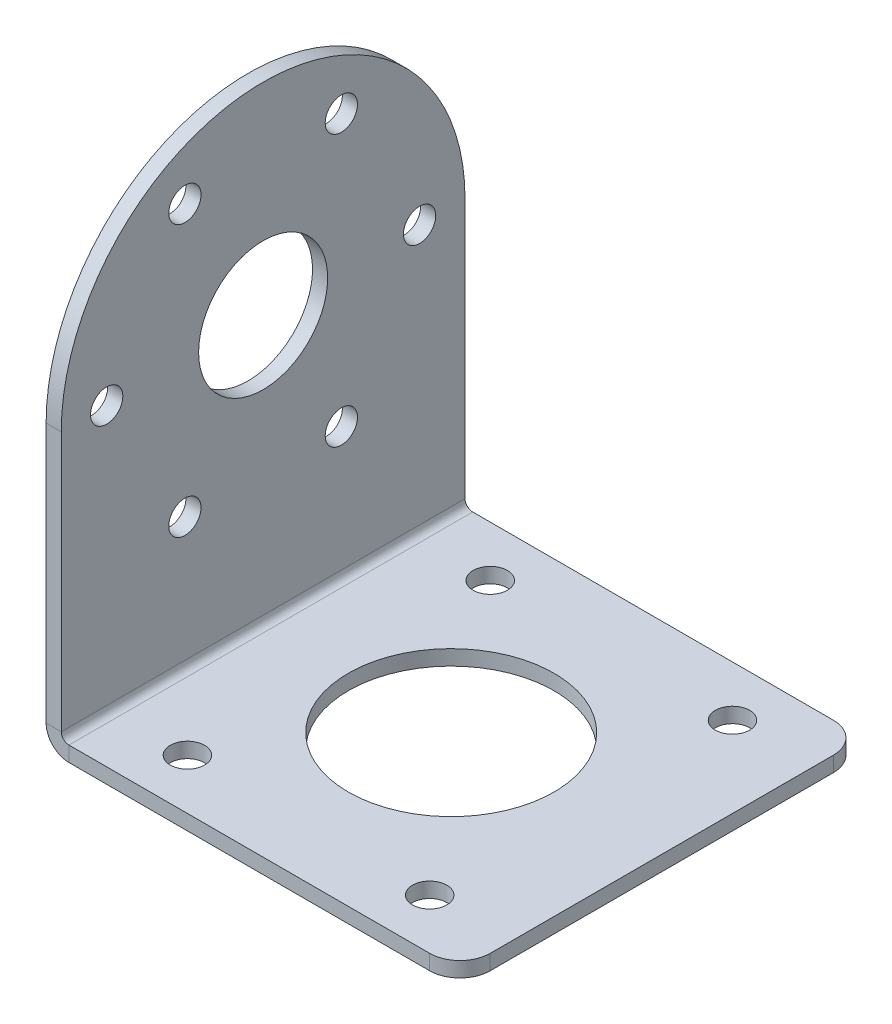
ISO-10303-21;
HEADER;
FILE_DESCRIPTION(('STEP AP214'),'2;1');
FILE_NAME('part.step','',(''),(''),'','','');
FILE_SCHEMA(('AUTOMOTIVE_DESIGN { 1 0 10303 214 1 1 1 1 }'));
ENDSEC;
DATA;
#1=APPLICATION_CONTEXT('core data for automotive mechanical design processes');
#2=APPLICATION_PROTOCOL_DEFINITION('international standard','automotive_design',2000,#1);
#3=PRODUCT_CONTEXT('',#1,'mechanical');
#4=PRODUCT('Part','Part','',(#3));
#5=PRODUCT_RELATED_PRODUCT_CATEGORY('part','',(#4));
#6=PRODUCT_DEFINITION_FORMATION('','',#4);
#7=PRODUCT_DEFINITION_CONTEXT('part definition',#1,'design');
#8=PRODUCT_DEFINITION('design','',#6,#7);
#9=PRODUCT_DEFINITION_SHAPE('','',#8);
#10=(LENGTH_UNIT() NAMED_UNIT(*) SI_UNIT(.MILLI.,.METRE.));
#11=(NAMED_UNIT(*) PLANE_ANGLE_UNIT() SI_UNIT($,.RADIAN.));
#12=(NAMED_UNIT(*) SI_UNIT($,.STERADIAN.) SOLID_ANGLE_UNIT());
#13=UNCERTAINTY_MEASURE_WITH_UNIT(LENGTH_MEASURE(1.E-05),#10,'distance_accuracy_value','');
#14=(GEOMETRIC_REPRESENTATION_CONTEXT(3) GLOBAL_UNCERTAINTY_ASSIGNED_CONTEXT((#13)) GLOBAL_UNIT_ASSIGNED_CONTEXT((#10,
#11,#12)) REPRESENTATION_CONTEXT('',''));
#15=CARTESIAN_POINT('',(0.,0.,0.));
#16=DIRECTION('',(0.,0.,1.));
#17=DIRECTION('',(1.,0.,0.));
#18=AXIS2_PLACEMENT_3D('',#15,#16,#17);
#19=CARTESIAN_POINT('',(0.,0.,0.));
#20=DIRECTION('',(1.,0.,0.));
#21=DIRECTION('',(0.,0.,-1.));
#22=AXIS2_PLACEMENT_3D('',#19,#20,#21);
#23=PLANE('',#22);
#24=CARTESIAN_POINT('',(0.,0.,0.));
#25=DIRECTION('',(-1.,0.,0.));
#26=DIRECTION('',(0.,0.,1.));
#27=AXIS2_PLACEMENT_3D('',#24,#25,#26);
#28=CIRCLE('',#27,6.39316793394791);
#29=CARTESIAN_POINT('',(0.,0.,6.39316793394791));
#30=VERTEX_POINT('',#29);
#31=EDGE_CURVE('E248',#30,#30,#28,.T.);
#32=ORIENTED_EDGE('',*,*,#31,.F.);
#33=EDGE_LOOP('',(#32));
#34=FACE_BOUND('',#33,.T.);
#35=CARTESIAN_POINT('',(0.,-13.4233937586589,7.74999999999988));
#36=DIRECTION('',(-1.,0.,0.));
#37=DIRECTION('',(0.,0.,1.));
#38=AXIS2_PLACEMENT_3D('',#35,#36,#37);
#39=CIRCLE('',#38,1.6);
#40=CARTESIAN_POINT('',(0.,-13.4233937586589,9.34999999999988));
#41=VERTEX_POINT('',#40);
#42=EDGE_CURVE('E319',#41,#41,#39,.T.);
#43=ORIENTED_EDGE('',*,*,#42,.F.);
#44=EDGE_LOOP('',(#43));
#45=FACE_BOUND('',#44,.T.);
#46=CARTESIAN_POINT('',(0.,13.4233937586588,7.75000000000006));
#47=DIRECTION('',(-1.,0.,0.));
#48=DIRECTION('',(0.,0.,1.));
#49=AXIS2_PLACEMENT_3D('',#46,#47,#48);
#50=CIRCLE('',#49,1.6);
#51=CARTESIAN_POINT('',(0.,13.4233937586588,9.35000000000006));
#52=VERTEX_POINT('',#51);
#53=EDGE_CURVE('E303',#52,#52,#50,.T.);
#54=ORIENTED_EDGE('',*,*,#53,.F.);
#55=EDGE_LOOP('',(#54));
#56=FACE_BOUND('',#55,.T.);
#57=CARTESIAN_POINT('',(0.,13.4233937586588,-7.74999999999997));
#58=DIRECTION('',(-1.,0.,0.));
#59=DIRECTION('',(0.,0.,1.));
#60=AXIS2_PLACEMENT_3D('',#57,#58,#59);
#61=CIRCLE('',#60,1.6);
#62=CARTESIAN_POINT('',(0.,13.4233937586588,-6.14999999999997));
#63=VERTEX_POINT('',#62);
#64=EDGE_CURVE('E242',#63,#63,#61,.T.);
#65=ORIENTED_EDGE('',*,*,#64,.F.);
#66=EDGE_LOOP('',(#65));
#67=FACE_BOUND('',#66,.T.);
#68=CARTESIAN_POINT('',(0.,0.,-15.5));
#69=DIRECTION('',(-1.,0.,0.));
#70=DIRECTION('',(0.,0.,1.));
#71=AXIS2_PLACEMENT_3D('',#68,#69,#70);
#72=CIRCLE('',#71,1.6);
#73=CARTESIAN_POINT('',(0.,0.,-13.9));
#74=VERTEX_POINT('',#73);
#75=EDGE_CURVE('E241',#74,#74,#72,.T.);
#76=ORIENTED_EDGE('',*,*,#75,.F.);
#77=EDGE_LOOP('',(#76));
#78=FACE_BOUND('',#77,.T.);
#79=DIRECTION('',(0.,1.,0.));
#80=VECTOR('',#79,1.);
#81=CARTESIAN_POINT('',(0.,0.,-20.));
#82=LINE('',#81,#80);
#83=CARTESIAN_POINT('',(0.,-25.738,-20.));
#84=VERTEX_POINT('',#83);
#85=CARTESIAN_POINT('',(0.,0.,-20.));
#86=VERTEX_POINT('',#85);
#87=EDGE_CURVE('E170',#84,#86,#82,.T.);
#88=ORIENTED_EDGE('',*,*,#87,.F.);
#89=DIRECTION('',(0.,0.,-1.));
#90=VECTOR('',#89,1.);
#91=CARTESIAN_POINT('',(0.,-25.738,0.));
#92=LINE('',#91,#90);
#93=CARTESIAN_POINT('',(0.,-25.738,20.));
#94=VERTEX_POINT('',#93);
#95=EDGE_CURVE('E164',#84,#94,#92,.F.);
#96=ORIENTED_EDGE('',*,*,#95,.T.);
#97=DIRECTION('',(0.,-1.,0.));
#98=VECTOR('',#97,1.);
#99=CARTESIAN_POINT('',(0.,0.,20.));
#100=LINE('',#99,#98);
#101=CARTESIAN_POINT('',(0.,0.,20.));
#102=VERTEX_POINT('',#101);
#103=EDGE_CURVE('E146',#102,#94,#100,.T.);
#104=ORIENTED_EDGE('',*,*,#103,.F.);
#105=CARTESIAN_POINT('',(0.,0.,0.));
#106=DIRECTION('',(1.,0.,0.));
#107=DIRECTION('',(0.,0.,-1.));
#108=AXIS2_PLACEMENT_3D('',#105,#106,#107);
#109=CIRCLE('',#108,20.);
#110=EDGE_CURVE('E161',#86,#102,#109,.T.);
#111=ORIENTED_EDGE('',*,*,#110,.F.);
#112=EDGE_LOOP('',(#88,#96,#104,#111));
#113=FACE_BOUND('',#112,.T.);
#114=CARTESIAN_POINT('',(0.,0.,15.5));
#115=DIRECTION('',(-1.,0.,0.));
#116=DIRECTION('',(0.,0.,1.));
#117=AXIS2_PLACEMENT_3D('',#114,#115,#116);
#118=CIRCLE('',#117,1.6);
#119=CARTESIAN_POINT('',(0.,0.,17.1));
#120=VERTEX_POINT('',#119);
#121=EDGE_CURVE('E311',#120,#120,#118,.T.);
#122=ORIENTED_EDGE('',*,*,#121,.F.);
#123=EDGE_LOOP('',(#122));
#124=FACE_BOUND('',#123,.T.);
#125=CARTESIAN_POINT('',(0.,-13.4233937586587,-7.75000000000016));
#126=DIRECTION('',(-1.,0.,0.));
#127=DIRECTION('',(0.,0.,1.));
#128=AXIS2_PLACEMENT_3D('',#125,#126,#127);
#129=CIRCLE('',#128,1.6);
#130=CARTESIAN_POINT('',(0.,-13.4233937586587,-6.15000000000016));
#131=VERTEX_POINT('',#130);
#132=EDGE_CURVE('E247',#131,#131,#129,.T.);
#133=ORIENTED_EDGE('',*,*,#132,.F.);
#134=EDGE_LOOP('',(#133));
#135=FACE_BOUND('',#134,.T.);
#136=ADVANCED_FACE('F46',(#34,#45,#56,#67,#78,#113,#124,#135),#23,.F.);
#137=CARTESIAN_POINT('',(1.5,-28.,-20.));
#138=DIRECTION('',(0.,0.,-1.));
#139=DIRECTION('',(-1.,0.,0.));
#140=AXIS2_PLACEMENT_3D('',#137,#138,#139);
#141=PLANE('',#140);
#142=DIRECTION('',(1.,0.,0.));
#143=VECTOR('',#142,1.);
#144=CARTESIAN_POINT('',(1.5,-26.5,-20.));
#145=LINE('',#144,#143);
#146=CARTESIAN_POINT('',(38.,-26.5,-20.));
#147=VERTEX_POINT('',#146);
#148=CARTESIAN_POINT('',(2.262,-26.5,-20.));
#149=VERTEX_POINT('',#148);
#150=EDGE_CURVE('E214',#147,#149,#145,.F.);
#151=ORIENTED_EDGE('',*,*,#150,.F.);
#152=DIRECTION('',(0.,1.,0.));
#153=VECTOR('',#152,1.);
#154=CARTESIAN_POINT('',(38.,-28.,-20.));
#155=LINE('',#154,#153);
#156=CARTESIAN_POINT('',(38.,-28.,-20.));
#157=VERTEX_POINT('',#156);
#158=EDGE_CURVE('E235',#147,#157,#155,.F.);
#159=ORIENTED_EDGE('',*,*,#158,.T.);
#160=DIRECTION('',(-1.,0.,0.));
#161=VECTOR('',#160,1.);
#162=CARTESIAN_POINT('',(1.5,-28.,-20.));
#163=LINE('',#162,#161);
#164=CARTESIAN_POINT('',(2.262,-28.,-20.));
#165=VERTEX_POINT('',#164);
#166=EDGE_CURVE('E194',#157,#165,#163,.T.);
#167=ORIENTED_EDGE('',*,*,#166,.T.);
#168=DIRECTION('',(0.,-1.,0.));
#169=VECTOR('',#168,1.);
#170=CARTESIAN_POINT('',(2.262,-28.,-20.));
#171=LINE('',#170,#169);
#172=EDGE_CURVE('E232',#149,#165,#171,.T.);
#173=ORIENTED_EDGE('',*,*,#172,.F.);
#174=EDGE_LOOP('',(#151,#159,#167,#173));
#175=FACE_BOUND('',#174,.T.);
#176=ADVANCED_FACE('F274',(#175),#141,.T.);
#177=CARTESIAN_POINT('',(41.,-28.,20.));
#178=DIRECTION('',(-1.,0.,0.));
#179=DIRECTION('',(0.,0.,1.));
#180=AXIS2_PLACEMENT_3D('',#177,#178,#179);
#181=PLANE('',#180);
#182=DIRECTION('',(0.,0.,1.));
#183=VECTOR('',#182,1.);
#184=CARTESIAN_POINT('',(41.,-28.,20.));
#185=LINE('',#184,#183);
#186=CARTESIAN_POINT('',(41.,-28.,-17.));
#187=VERTEX_POINT('',#186);
#188=CARTESIAN_POINT('',(41.,-28.,17.));
#189=VERTEX_POINT('',#188);
#190=EDGE_CURVE('E281',#187,#189,#185,.T.);
#191=ORIENTED_EDGE('',*,*,#190,.F.);
#192=DIRECTION('',(0.,-1.,0.));
#193=VECTOR('',#192,1.);
#194=CARTESIAN_POINT('',(41.,-28.,-17.));
#195=LINE('',#194,#193);
#196=CARTESIAN_POINT('',(41.,-26.5,-17.));
#197=VERTEX_POINT('',#196);
#198=EDGE_CURVE('E260',#187,#197,#195,.F.);
#199=ORIENTED_EDGE('',*,*,#198,.T.);
#200=DIRECTION('',(0.,0.,1.));
#201=VECTOR('',#200,1.);
#202=CARTESIAN_POINT('',(41.,-26.5,20.));
#203=LINE('',#202,#201);
#204=CARTESIAN_POINT('',(41.,-26.5,17.));
#205=VERTEX_POINT('',#204);
#206=EDGE_CURVE('E218',#197,#205,#203,.T.);
#207=ORIENTED_EDGE('',*,*,#206,.T.);
#208=DIRECTION('',(0.,1.,0.));
#209=VECTOR('',#208,1.);
#210=CARTESIAN_POINT('',(41.,-28.,17.));
#211=LINE('',#210,#209);
#212=EDGE_CURVE('E257',#205,#189,#211,.F.);
#213=ORIENTED_EDGE('',*,*,#212,.T.);
#214=EDGE_LOOP('',(#191,#199,#207,#213));
#215=FACE_BOUND('',#214,.T.);
#216=ADVANCED_FACE('F283',(#215),#181,.F.);
#217=CARTESIAN_POINT('',(1.5,-28.,20.));
#218=DIRECTION('',(0.,0.,-1.));
#219=DIRECTION('',(-1.,0.,0.));
#220=AXIS2_PLACEMENT_3D('',#217,#218,#219);
#221=PLANE('',#220);
#222=DIRECTION('',(-1.,0.,0.));
#223=VECTOR('',#222,1.);
#224=CARTESIAN_POINT('',(1.5,-28.,20.));
#225=LINE('',#224,#223);
#226=CARTESIAN_POINT('',(38.,-28.,20.));
#227=VERTEX_POINT('',#226);
#228=CARTESIAN_POINT('',(2.262,-28.,20.));
#229=VERTEX_POINT('',#228);
#230=EDGE_CURVE('E166',#227,#229,#225,.T.);
#231=ORIENTED_EDGE('',*,*,#230,.F.);
#232=DIRECTION('',(0.,1.,0.));
#233=VECTOR('',#232,1.);
#234=CARTESIAN_POINT('',(38.,-28.,20.));
#235=LINE('',#234,#233);
#236=CARTESIAN_POINT('',(38.,-26.5,20.));
#237=VERTEX_POINT('',#236);
#238=EDGE_CURVE('E11',#227,#237,#235,.T.);
#239=ORIENTED_EDGE('',*,*,#238,.T.);
#240=DIRECTION('',(1.,0.,0.));
#241=VECTOR('',#240,1.);
#242=CARTESIAN_POINT('',(1.5,-26.5,20.));
#243=LINE('',#242,#241);
#244=CARTESIAN_POINT('',(2.262,-26.5,20.));
#245=VERTEX_POINT('',#244);
#246=EDGE_CURVE('E209',#237,#245,#243,.F.);
#247=ORIENTED_EDGE('',*,*,#246,.T.);
#248=DIRECTION('',(0.,-1.,0.));
#249=VECTOR('',#248,1.);
#250=CARTESIAN_POINT('',(2.262,-28.,20.));
#251=LINE('',#250,#249);
#252=EDGE_CURVE('E229',#245,#229,#251,.T.);
#253=ORIENTED_EDGE('',*,*,#252,.T.);
#254=EDGE_LOOP('',(#231,#239,#247,#253));
#255=FACE_BOUND('',#254,.T.);
#256=ADVANCED_FACE('F441',(#255),#221,.F.);
#257=CARTESIAN_POINT('',(2.262,-25.738,20.));
#258=DIRECTION('',(0.,0.,1.));
#259=DIRECTION('',(0.,-1.,0.));
#260=AXIS2_PLACEMENT_3D('',#257,#258,#259);
#261=PLANE('',#260);
#262=ORIENTED_EDGE('',*,*,#252,.F.);
#263=CARTESIAN_POINT('',(2.262,-25.738,20.));
#264=DIRECTION('',(0.,0.,-1.));
#265=DIRECTION('',(-1.,0.,0.));
#266=AXIS2_PLACEMENT_3D('',#263,#264,#265);
#267=CIRCLE('',#266,0.762);
#268=CARTESIAN_POINT('',(1.5,-25.738,20.));
#269=VERTEX_POINT('',#268);
#270=EDGE_CURVE('E210',#245,#269,#267,.T.);
#271=ORIENTED_EDGE('',*,*,#270,.T.);
#272=DIRECTION('',(-1.,0.,0.));
#273=VECTOR('',#272,1.);
#274=CARTESIAN_POINT('',(0.,-25.738,20.));
#275=LINE('',#274,#273);
#276=EDGE_CURVE('E154',#269,#94,#275,.T.);
#277=ORIENTED_EDGE('',*,*,#276,.T.);
#278=CARTESIAN_POINT('',(2.262,-25.738,20.));
#279=DIRECTION('',(0.,0.,-1.));
#280=DIRECTION('',(0.,1.,0.));
#281=AXIS2_PLACEMENT_3D('',#278,#279,#280);
#282=CIRCLE('',#281,2.262);
#283=EDGE_CURVE('E189',#229,#94,#282,.T.);
#284=ORIENTED_EDGE('',*,*,#283,.F.);
#285=EDGE_LOOP('',(#262,#271,#277,#284));
#286=FACE_BOUND('',#285,.T.);
#287=ADVANCED_FACE('F439',(#286),#261,.T.);
#288=CARTESIAN_POINT('',(0.,0.,20.));
#289=DIRECTION('',(0.,0.,1.));
#290=DIRECTION('',(0.,-1.,0.));
#291=AXIS2_PLACEMENT_3D('',#288,#289,#290);
#292=PLANE('',#291);
#293=ORIENTED_EDGE('',*,*,#276,.F.);
#294=DIRECTION('',(0.,1.,0.));
#295=VECTOR('',#294,1.);
#296=CARTESIAN_POINT('',(1.5,0.,20.));
#297=LINE('',#296,#295);
#298=CARTESIAN_POINT('',(1.5,0.,20.));
#299=VERTEX_POINT('',#298);
#300=EDGE_CURVE('E149',#299,#269,#297,.F.);
#301=ORIENTED_EDGE('',*,*,#300,.F.);
#302=DIRECTION('',(-1.,0.,0.));
#303=VECTOR('',#302,1.);
#304=CARTESIAN_POINT('',(0.,0.,20.));
#305=LINE('',#304,#303);
#306=EDGE_CURVE('E143',#299,#102,#305,.T.);
#307=ORIENTED_EDGE('',*,*,#306,.T.);
#308=ORIENTED_EDGE('',*,*,#103,.T.);
#309=EDGE_LOOP('',(#293,#301,#307,#308));
#310=FACE_BOUND('',#309,.T.);
#311=ADVANCED_FACE('F145',(#310),#292,.T.);
#312=CARTESIAN_POINT('',(0.,0.,0.));
#313=DIRECTION('',(1.,0.,0.));
#314=DIRECTION('',(0.,0.,-1.));
#315=AXIS2_PLACEMENT_3D('',#312,#313,#314);
#316=CYLINDRICAL_SURFACE('',#315,20.);
#317=ORIENTED_EDGE('',*,*,#306,.F.);
#318=CARTESIAN_POINT('',(1.5,0.,0.));
#319=DIRECTION('',(1.,0.,0.));
#320=DIRECTION('',(0.,0.,-1.));
#321=AXIS2_PLACEMENT_3D('',#318,#319,#320);
#322=CIRCLE('',#321,20.);
#323=CARTESIAN_POINT('',(1.5,0.,-20.));
#324=VERTEX_POINT('',#323);
#325=EDGE_CURVE('E205',#324,#299,#322,.T.);
#326=ORIENTED_EDGE('',*,*,#325,.F.);
#327=DIRECTION('',(-1.,0.,0.));
#328=VECTOR('',#327,1.);
#329=CARTESIAN_POINT('',(0.,0.,-20.));
#330=LINE('',#329,#328);
#331=EDGE_CURVE('E155',#324,#86,#330,.T.);
#332=ORIENTED_EDGE('',*,*,#331,.T.);
#333=ORIENTED_EDGE('',*,*,#110,.T.);
#334=EDGE_LOOP('',(#317,#326,#332,#333));
#335=FACE_BOUND('',#334,.T.);
#336=ADVANCED_FACE('F168',(#335),#316,.T.);
#337=CARTESIAN_POINT('',(0.,0.,-20.));
#338=DIRECTION('',(0.,0.,-1.));
#339=DIRECTION('',(0.,1.,0.));
#340=AXIS2_PLACEMENT_3D('',#337,#338,#339);
#341=PLANE('',#340);
#342=ORIENTED_EDGE('',*,*,#331,.F.);
#343=DIRECTION('',(0.,1.,0.));
#344=VECTOR('',#343,1.);
#345=CARTESIAN_POINT('',(1.5,0.,-20.));
#346=LINE('',#345,#344);
#347=CARTESIAN_POINT('',(1.5,-25.738,-20.));
#348=VERTEX_POINT('',#347);
#349=EDGE_CURVE('E202',#348,#324,#346,.T.);
#350=ORIENTED_EDGE('',*,*,#349,.F.);
#351=DIRECTION('',(-1.,0.,0.));
#352=VECTOR('',#351,1.);
#353=CARTESIAN_POINT('',(0.,-25.738,-20.));
#354=LINE('',#353,#352);
#355=EDGE_CURVE('E184',#348,#84,#354,.T.);
#356=ORIENTED_EDGE('',*,*,#355,.T.);
#357=ORIENTED_EDGE('',*,*,#87,.T.);
#358=EDGE_LOOP('',(#342,#350,#356,#357));
#359=FACE_BOUND('',#358,.T.);
#360=ADVANCED_FACE('F430',(#359),#341,.T.);
#361=CARTESIAN_POINT('',(2.262,-25.738,-20.));
#362=DIRECTION('',(0.,0.,1.));
#363=DIRECTION('',(0.,-1.,0.));
#364=AXIS2_PLACEMENT_3D('',#361,#362,#363);
#365=PLANE('',#364);
#366=CARTESIAN_POINT('',(2.262,-25.738,-20.));
#367=DIRECTION('',(0.,0.,-1.));
#368=DIRECTION('',(-1.,0.,0.));
#369=AXIS2_PLACEMENT_3D('',#366,#367,#368);
#370=CIRCLE('',#369,0.762);
#371=EDGE_CURVE('E215',#348,#149,#370,.F.);
#372=ORIENTED_EDGE('',*,*,#371,.T.);
#373=ORIENTED_EDGE('',*,*,#172,.T.);
#374=CARTESIAN_POINT('',(2.262,-25.738,-20.));
#375=DIRECTION('',(0.,0.,-1.));
#376=DIRECTION('',(0.,1.,0.));
#377=AXIS2_PLACEMENT_3D('',#374,#375,#376);
#378=CIRCLE('',#377,2.262);
#379=EDGE_CURVE('E185',#84,#165,#378,.F.);
#380=ORIENTED_EDGE('',*,*,#379,.F.);
#381=ORIENTED_EDGE('',*,*,#355,.F.);
#382=EDGE_LOOP('',(#372,#373,#380,#381));
#383=FACE_BOUND('',#382,.T.);
#384=ADVANCED_FACE('F433',(#383),#365,.F.);
#385=CARTESIAN_POINT('',(1.5,-28.,20.));
#386=DIRECTION('',(0.,1.,0.));
#387=DIRECTION('',(0.,0.,1.));
#388=AXIS2_PLACEMENT_3D('',#385,#386,#387);
#389=PLANE('',#388);
#390=CARTESIAN_POINT('',(20.131,-28.,0.));
#391=DIRECTION('',(0.,1.,0.));
#392=DIRECTION('',(0.,0.,1.));
#393=AXIS2_PLACEMENT_3D('',#390,#391,#392);
#394=CIRCLE('',#393,10.1950455226564);
#395=CARTESIAN_POINT('',(20.131,-28.,10.1950455226564));
#396=VERTEX_POINT('',#395);
#397=EDGE_CURVE('E365',#396,#396,#394,.T.);
#398=ORIENTED_EDGE('',*,*,#397,.T.);
#399=EDGE_LOOP('',(#398));
#400=FACE_BOUND('',#399,.T.);
#401=CARTESIAN_POINT('',(9.00000000000001,-28.,-15.));
#402=DIRECTION('',(0.,1.,0.));
#403=DIRECTION('',(0.,0.,1.));
#404=AXIS2_PLACEMENT_3D('',#401,#402,#403);
#405=CIRCLE('',#404,1.7);
#406=CARTESIAN_POINT('',(9.00000000000001,-28.,-13.3));
#407=VERTEX_POINT('',#406);
#408=EDGE_CURVE('E361',#407,#407,#405,.T.);
#409=ORIENTED_EDGE('',*,*,#408,.T.);
#410=EDGE_LOOP('',(#409));
#411=FACE_BOUND('',#410,.T.);
#412=CARTESIAN_POINT('',(9.00000000000001,-28.,15.));
#413=DIRECTION('',(0.,1.,0.));
#414=DIRECTION('',(0.,0.,1.));
#415=AXIS2_PLACEMENT_3D('',#412,#413,#414);
#416=CIRCLE('',#415,1.7);
#417=CARTESIAN_POINT('',(9.00000000000001,-28.,16.7));
#418=VERTEX_POINT('',#417);
#419=EDGE_CURVE('E353',#418,#418,#416,.T.);
#420=ORIENTED_EDGE('',*,*,#419,.T.);
#421=EDGE_LOOP('',(#420));
#422=FACE_BOUND('',#421,.T.);
#423=CARTESIAN_POINT('',(33.,-28.,15.));
#424=DIRECTION('',(0.,1.,0.));
#425=DIRECTION('',(0.,0.,1.));
#426=AXIS2_PLACEMENT_3D('',#423,#424,#425);
#427=CIRCLE('',#426,1.7);
#428=CARTESIAN_POINT('',(33.,-28.,16.7));
#429=VERTEX_POINT('',#428);
#430=EDGE_CURVE('E341',#429,#429,#427,.T.);
#431=ORIENTED_EDGE('',*,*,#430,.T.);
#432=EDGE_LOOP('',(#431));
#433=FACE_BOUND('',#432,.T.);
#434=CARTESIAN_POINT('',(33.,-28.,-15.));
#435=DIRECTION('',(0.,1.,0.));
#436=DIRECTION('',(0.,0.,1.));
#437=AXIS2_PLACEMENT_3D('',#434,#435,#436);
#438=CIRCLE('',#437,1.7);
#439=CARTESIAN_POINT('',(33.,-28.,-13.3));
#440=VERTEX_POINT('',#439);
#441=EDGE_CURVE('E333',#440,#440,#438,.T.);
#442=ORIENTED_EDGE('',*,*,#441,.T.);
#443=EDGE_LOOP('',(#442));
#444=FACE_BOUND('',#443,.T.);
#445=ORIENTED_EDGE('',*,*,#166,.F.);
#446=CARTESIAN_POINT('',(38.,-28.,-17.));
#447=DIRECTION('',(0.,1.,0.));
#448=DIRECTION('',(0.,0.,1.));
#449=AXIS2_PLACEMENT_3D('',#446,#447,#448);
#450=CIRCLE('',#449,3.);
#451=EDGE_CURVE('E254',#157,#187,#450,.F.);
#452=ORIENTED_EDGE('',*,*,#451,.T.);
#453=ORIENTED_EDGE('',*,*,#190,.T.);
#454=CARTESIAN_POINT('',(38.,-28.,17.));
#455=DIRECTION('',(0.,1.,0.));
#456=DIRECTION('',(0.,0.,1.));
#457=AXIS2_PLACEMENT_3D('',#454,#455,#456);
#458=CIRCLE('',#457,3.);
#459=EDGE_CURVE('E251',#189,#227,#458,.F.);
#460=ORIENTED_EDGE('',*,*,#459,.T.);
#461=ORIENTED_EDGE('',*,*,#230,.T.);
#462=DIRECTION('',(0.,0.,-1.));
#463=VECTOR('',#462,1.);
#464=CARTESIAN_POINT('',(2.262,-28.,20.));
#465=LINE('',#464,#463);
#466=EDGE_CURVE('E175',#229,#165,#465,.T.);
#467=ORIENTED_EDGE('',*,*,#466,.T.);
#468=EDGE_LOOP('',(#445,#452,#453,#460,#461,#467));
#469=FACE_BOUND('',#468,.T.);
#470=ADVANCED_FACE('F280',(#400,#411,#422,#433,#444,#469),#389,.F.);
#471=CARTESIAN_POINT('',(2.262,-25.738,20.));
#472=DIRECTION('',(0.,0.,-1.));
#473=DIRECTION('',(-1.,0.,0.));
#474=AXIS2_PLACEMENT_3D('',#471,#472,#473);
#475=CYLINDRICAL_SURFACE('',#474,2.262);
#476=ORIENTED_EDGE('',*,*,#283,.T.);
#477=ORIENTED_EDGE('',*,*,#95,.F.);
#478=ORIENTED_EDGE('',*,*,#379,.T.);
#479=ORIENTED_EDGE('',*,*,#466,.F.);
#480=EDGE_LOOP('',(#476,#477,#478,#479));
#481=FACE_BOUND('',#480,.T.);
#482=ADVANCED_FACE('F420',(#481),#475,.T.);
#483=CARTESIAN_POINT('',(1.5,0.,0.));
#484=DIRECTION('',(1.,0.,0.));
#485=DIRECTION('',(0.,0.,-1.));
#486=AXIS2_PLACEMENT_3D('',#483,#484,#485);
#487=PLANE('',#486);
#488=CARTESIAN_POINT('',(1.5,0.,0.));
#489=DIRECTION('',(1.,0.,0.));
#490=DIRECTION('',(0.,0.,-1.));
#491=AXIS2_PLACEMENT_3D('',#488,#489,#490);
#492=CIRCLE('',#491,6.39316793394791);
#493=CARTESIAN_POINT('',(1.49999999999999,0.,6.39316793394791));
#494=VERTEX_POINT('',#493);
#495=EDGE_CURVE('E243',#494,#494,#492,.T.);
#496=ORIENTED_EDGE('',*,*,#495,.F.);
#497=EDGE_LOOP('',(#496));
#498=FACE_BOUND('',#497,.T.);
#499=CARTESIAN_POINT('',(1.5,-13.4233937586587,-7.75000000000016));
#500=DIRECTION('',(1.,0.,0.));
#501=DIRECTION('',(0.,0.,-1.));
#502=AXIS2_PLACEMENT_3D('',#499,#500,#501);
#503=CIRCLE('',#502,1.59999999999999);
#504=CARTESIAN_POINT('',(1.5,-13.4233937586587,-9.35000000000015));
#505=VERTEX_POINT('',#504);
#506=EDGE_CURVE('E323',#505,#505,#503,.T.);
#507=ORIENTED_EDGE('',*,*,#506,.F.);
#508=EDGE_LOOP('',(#507));
#509=FACE_BOUND('',#508,.T.);
#510=CARTESIAN_POINT('',(1.5,-13.4233937586589,7.74999999999988));
#511=DIRECTION('',(1.,0.,0.));
#512=DIRECTION('',(0.,0.,-1.));
#513=AXIS2_PLACEMENT_3D('',#510,#511,#512);
#514=CIRCLE('',#513,1.59999999999999);
#515=CARTESIAN_POINT('',(1.5,-13.4233937586589,6.14999999999988));
#516=VERTEX_POINT('',#515);
#517=EDGE_CURVE('E315',#516,#516,#514,.T.);
#518=ORIENTED_EDGE('',*,*,#517,.F.);
#519=EDGE_LOOP('',(#518));
#520=FACE_BOUND('',#519,.T.);
#521=CARTESIAN_POINT('',(1.5,0.,15.5));
#522=DIRECTION('',(1.,0.,0.));
#523=DIRECTION('',(0.,0.,-1.));
#524=AXIS2_PLACEMENT_3D('',#521,#522,#523);
#525=CIRCLE('',#524,1.59999999999999);
#526=CARTESIAN_POINT('',(1.5,0.,13.9));
#527=VERTEX_POINT('',#526);
#528=EDGE_CURVE('E307',#527,#527,#525,.T.);
#529=ORIENTED_EDGE('',*,*,#528,.F.);
#530=EDGE_LOOP('',(#529));
#531=FACE_BOUND('',#530,.T.);
#532=CARTESIAN_POINT('',(1.5,13.4233937586588,7.75000000000006));
#533=DIRECTION('',(1.,0.,0.));
#534=DIRECTION('',(0.,0.,-1.));
#535=AXIS2_PLACEMENT_3D('',#532,#533,#534);
#536=CIRCLE('',#535,1.59999999999999);
#537=CARTESIAN_POINT('',(1.5,13.4233937586588,6.15000000000007));
#538=VERTEX_POINT('',#537);
#539=EDGE_CURVE('E299',#538,#538,#536,.T.);
#540=ORIENTED_EDGE('',*,*,#539,.F.);
#541=EDGE_LOOP('',(#540));
#542=FACE_BOUND('',#541,.T.);
#543=CARTESIAN_POINT('',(1.5,13.4233937586588,-7.74999999999997));
#544=DIRECTION('',(1.,0.,0.));
#545=DIRECTION('',(0.,0.,-1.));
#546=AXIS2_PLACEMENT_3D('',#543,#544,#545);
#547=CIRCLE('',#546,1.59999999999999);
#548=CARTESIAN_POINT('',(1.5,13.4233937586588,-9.34999999999996));
#549=VERTEX_POINT('',#548);
#550=EDGE_CURVE('E237',#549,#549,#547,.T.);
#551=ORIENTED_EDGE('',*,*,#550,.F.);
#552=EDGE_LOOP('',(#551));
#553=FACE_BOUND('',#552,.T.);
#554=CARTESIAN_POINT('',(1.5,0.,-15.5));
#555=DIRECTION('',(1.,0.,0.));
#556=DIRECTION('',(0.,0.,-1.));
#557=AXIS2_PLACEMENT_3D('',#554,#555,#556);
#558=CIRCLE('',#557,1.59999999999999);
#559=CARTESIAN_POINT('',(1.5,0.,-17.1));
#560=VERTEX_POINT('',#559);
#561=EDGE_CURVE('E226',#560,#560,#558,.T.);
#562=ORIENTED_EDGE('',*,*,#561,.F.);
#563=EDGE_LOOP('',(#562));
#564=FACE_BOUND('',#563,.T.);
#565=ORIENTED_EDGE('',*,*,#349,.T.);
#566=ORIENTED_EDGE('',*,*,#325,.T.);
#567=ORIENTED_EDGE('',*,*,#300,.T.);
#568=DIRECTION('',(0.,0.,-1.));
#569=VECTOR('',#568,1.);
#570=CARTESIAN_POINT('',(1.5,-25.738,0.));
#571=LINE('',#570,#569);
#572=EDGE_CURVE('E190',#348,#269,#571,.F.);
#573=ORIENTED_EDGE('',*,*,#572,.F.);
#574=EDGE_LOOP('',(#565,#566,#567,#573));
#575=FACE_BOUND('',#574,.T.);
#576=ADVANCED_FACE('F380',(#498,#509,#520,#531,#542,#553,#564,#575),#487,.T.);
#577=CARTESIAN_POINT('',(1.5,-26.5,20.));
#578=DIRECTION('',(0.,1.,0.));
#579=DIRECTION('',(0.,0.,1.));
#580=AXIS2_PLACEMENT_3D('',#577,#578,#579);
#581=PLANE('',#580);
#582=CARTESIAN_POINT('',(20.131,-26.5,0.));
#583=DIRECTION('',(0.,1.,0.));
#584=DIRECTION('',(0.,0.,1.));
#585=AXIS2_PLACEMENT_3D('',#582,#583,#584);
#586=CIRCLE('',#585,10.1950455226564);
#587=CARTESIAN_POINT('',(20.131,-26.5,10.1950455226564));
#588=VERTEX_POINT('',#587);
#589=EDGE_CURVE('E369',#588,#588,#586,.T.);
#590=ORIENTED_EDGE('',*,*,#589,.F.);
#591=EDGE_LOOP('',(#590));
#592=FACE_BOUND('',#591,.T.);
#593=CARTESIAN_POINT('',(9.00000000000001,-26.5,-15.));
#594=DIRECTION('',(0.,1.,0.));
#595=DIRECTION('',(0.,0.,1.));
#596=AXIS2_PLACEMENT_3D('',#593,#594,#595);
#597=CIRCLE('',#596,1.7);
#598=CARTESIAN_POINT('',(9.00000000000001,-26.5,-13.3));
#599=VERTEX_POINT('',#598);
#600=EDGE_CURVE('E357',#599,#599,#597,.T.);
#601=ORIENTED_EDGE('',*,*,#600,.F.);
#602=EDGE_LOOP('',(#601));
#603=FACE_BOUND('',#602,.T.);
#604=CARTESIAN_POINT('',(9.00000000000001,-26.5,15.));
#605=DIRECTION('',(0.,1.,0.));
#606=DIRECTION('',(0.,0.,1.));
#607=AXIS2_PLACEMENT_3D('',#604,#605,#606);
#608=CIRCLE('',#607,1.7);
#609=CARTESIAN_POINT('',(9.00000000000001,-26.5,16.7));
#610=VERTEX_POINT('',#609);
#611=EDGE_CURVE('E349',#610,#610,#608,.T.);
#612=ORIENTED_EDGE('',*,*,#611,.F.);
#613=EDGE_LOOP('',(#612));
#614=FACE_BOUND('',#613,.T.);
#615=CARTESIAN_POINT('',(33.,-26.5,15.));
#616=DIRECTION('',(0.,1.,0.));
#617=DIRECTION('',(0.,0.,1.));
#618=AXIS2_PLACEMENT_3D('',#615,#616,#617);
#619=CIRCLE('',#618,1.7);
#620=CARTESIAN_POINT('',(33.,-26.5,16.7));
#621=VERTEX_POINT('',#620);
#622=EDGE_CURVE('E345',#621,#621,#619,.T.);
#623=ORIENTED_EDGE('',*,*,#622,.F.);
#624=EDGE_LOOP('',(#623));
#625=FACE_BOUND('',#624,.T.);
#626=CARTESIAN_POINT('',(33.,-26.5,-15.));
#627=DIRECTION('',(0.,1.,0.));
#628=DIRECTION('',(0.,0.,1.));
#629=AXIS2_PLACEMENT_3D('',#626,#627,#628);
#630=CIRCLE('',#629,1.7);
#631=CARTESIAN_POINT('',(33.,-26.5,-13.3));
#632=VERTEX_POINT('',#631);
#633=EDGE_CURVE('E337',#632,#632,#630,.T.);
#634=ORIENTED_EDGE('',*,*,#633,.F.);
#635=EDGE_LOOP('',(#634));
#636=FACE_BOUND('',#635,.T.);
#637=ORIENTED_EDGE('',*,*,#206,.F.);
#638=CARTESIAN_POINT('',(38.,-26.5,-17.));
#639=DIRECTION('',(0.,1.,0.));
#640=DIRECTION('',(0.,0.,1.));
#641=AXIS2_PLACEMENT_3D('',#638,#639,#640);
#642=CIRCLE('',#641,3.);
#643=EDGE_CURVE('E54',#197,#147,#642,.T.);
#644=ORIENTED_EDGE('',*,*,#643,.T.);
#645=ORIENTED_EDGE('',*,*,#150,.T.);
#646=DIRECTION('',(0.,0.,1.));
#647=VECTOR('',#646,1.);
#648=CARTESIAN_POINT('',(2.262,-26.5,20.));
#649=LINE('',#648,#647);
#650=EDGE_CURVE('E198',#245,#149,#649,.F.);
#651=ORIENTED_EDGE('',*,*,#650,.F.);
#652=ORIENTED_EDGE('',*,*,#246,.F.);
#653=CARTESIAN_POINT('',(38.,-26.5,17.));
#654=DIRECTION('',(0.,1.,0.));
#655=DIRECTION('',(0.,0.,1.));
#656=AXIS2_PLACEMENT_3D('',#653,#654,#655);
#657=CIRCLE('',#656,3.);
#658=EDGE_CURVE('E72',#237,#205,#657,.T.);
#659=ORIENTED_EDGE('',*,*,#658,.T.);
#660=EDGE_LOOP('',(#637,#644,#645,#651,#652,#659));
#661=FACE_BOUND('',#660,.T.);
#662=ADVANCED_FACE('F267',(#592,#603,#614,#625,#636,#661),#581,.T.);
#663=CARTESIAN_POINT('',(2.262,-25.738,20.));
#664=DIRECTION('',(0.,0.,-1.));
#665=DIRECTION('',(-1.,0.,0.));
#666=AXIS2_PLACEMENT_3D('',#663,#664,#665);
#667=CYLINDRICAL_SURFACE('',#666,0.762);
#668=ORIENTED_EDGE('',*,*,#270,.F.);
#669=ORIENTED_EDGE('',*,*,#650,.T.);
#670=ORIENTED_EDGE('',*,*,#371,.F.);
#671=ORIENTED_EDGE('',*,*,#572,.T.);
#672=EDGE_LOOP('',(#668,#669,#670,#671));
#673=FACE_BOUND('',#672,.T.);
#674=ADVANCED_FACE('F379',(#673),#667,.F.);
#675=CARTESIAN_POINT('',(0.,0.,-15.5));
#676=DIRECTION('',(-1.,0.,0.));
#677=DIRECTION('',(0.,0.,1.));
#678=AXIS2_PLACEMENT_3D('',#675,#676,#677);
#679=CYLINDRICAL_SURFACE('',#678,1.59999999999999);
#680=ORIENTED_EDGE('',*,*,#561,.T.);
#681=EDGE_LOOP('',(#680));
#682=FACE_BOUND('',#681,.T.);
#683=ORIENTED_EDGE('',*,*,#75,.T.);
#684=EDGE_LOOP('',(#683));
#685=FACE_BOUND('',#684,.T.);
#686=ADVANCED_FACE('F428',(#682,#685),#679,.F.);
#687=CARTESIAN_POINT('',(0.,13.4233937586588,-7.74999999999997));
#688=DIRECTION('',(-1.,0.,0.));
#689=DIRECTION('',(0.,0.,1.));
#690=AXIS2_PLACEMENT_3D('',#687,#688,#689);
#691=CYLINDRICAL_SURFACE('',#690,1.59999999999999);
#692=ORIENTED_EDGE('',*,*,#550,.T.);
#693=EDGE_LOOP('',(#692));
#694=FACE_BOUND('',#693,.T.);
#695=ORIENTED_EDGE('',*,*,#64,.T.);
#696=EDGE_LOOP('',(#695));
#697=FACE_BOUND('',#696,.T.);
#698=ADVANCED_FACE('F566',(#694,#697),#691,.F.);
#699=CARTESIAN_POINT('',(0.,13.4233937586588,7.75000000000006));
#700=DIRECTION('',(-1.,0.,0.));
#701=DIRECTION('',(0.,0.,1.));
#702=AXIS2_PLACEMENT_3D('',#699,#700,#701);
#703=CYLINDRICAL_SURFACE('',#702,1.59999999999999);
#704=ORIENTED_EDGE('',*,*,#539,.T.);
#705=EDGE_LOOP('',(#704));
#706=FACE_BOUND('',#705,.T.);
#707=ORIENTED_EDGE('',*,*,#53,.T.);
#708=EDGE_LOOP('',(#707));
#709=FACE_BOUND('',#708,.T.);
#710=ADVANCED_FACE('F574',(#706,#709),#703,.F.);
#711=CARTESIAN_POINT('',(0.,0.,15.5));
#712=DIRECTION('',(-1.,0.,0.));
#713=DIRECTION('',(0.,0.,1.));
#714=AXIS2_PLACEMENT_3D('',#711,#712,#713);
#715=CYLINDRICAL_SURFACE('',#714,1.59999999999999);
#716=ORIENTED_EDGE('',*,*,#528,.T.);
#717=EDGE_LOOP('',(#716));
#718=FACE_BOUND('',#717,.T.);
#719=ORIENTED_EDGE('',*,*,#121,.T.);
#720=EDGE_LOOP('',(#719));
#721=FACE_BOUND('',#720,.T.);
#722=ADVANCED_FACE('F584',(#718,#721),#715,.F.);
#723=CARTESIAN_POINT('',(0.,-13.4233937586589,7.74999999999988));
#724=DIRECTION('',(-1.,0.,0.));
#725=DIRECTION('',(0.,0.,1.));
#726=AXIS2_PLACEMENT_3D('',#723,#724,#725);
#727=CYLINDRICAL_SURFACE('',#726,1.59999999999999);
#728=ORIENTED_EDGE('',*,*,#517,.T.);
#729=EDGE_LOOP('',(#728));
#730=FACE_BOUND('',#729,.T.);
#731=ORIENTED_EDGE('',*,*,#42,.T.);
#732=EDGE_LOOP('',(#731));
#733=FACE_BOUND('',#732,.T.);
#734=ADVANCED_FACE('F594',(#730,#733),#727,.F.);
#735=CARTESIAN_POINT('',(0.,-13.4233937586587,-7.75000000000016));
#736=DIRECTION('',(-1.,0.,0.));
#737=DIRECTION('',(0.,0.,1.));
#738=AXIS2_PLACEMENT_3D('',#735,#736,#737);
#739=CYLINDRICAL_SURFACE('',#738,1.59999999999999);
#740=ORIENTED_EDGE('',*,*,#506,.T.);
#741=EDGE_LOOP('',(#740));
#742=FACE_BOUND('',#741,.T.);
#743=ORIENTED_EDGE('',*,*,#132,.T.);
#744=EDGE_LOOP('',(#743));
#745=FACE_BOUND('',#744,.T.);
#746=ADVANCED_FACE('F404',(#742,#745),#739,.F.);
#747=CARTESIAN_POINT('',(41.,0.,0.));
#748=DIRECTION('',(-1.,0.,0.));
#749=DIRECTION('',(0.,0.,1.));
#750=AXIS2_PLACEMENT_3D('',#747,#748,#749);
#751=CYLINDRICAL_SURFACE('',#750,6.39316793394791);
#752=CARTESIAN_POINT('',(1.49999999999999,0.,6.39316793394791));
#753=CARTESIAN_POINT('',(1.48437499999999,0.,6.39316793394791));
#754=CARTESIAN_POINT('',(1.46874999999999,0.,6.39316793394791));
#755=CARTESIAN_POINT('',(1.43749999999999,0.,6.39316793394791));
#756=CARTESIAN_POINT('',(1.421875,0.,6.39316793394791));
#757=CARTESIAN_POINT('',(1.390625,0.,6.39316793394791));
#758=CARTESIAN_POINT('',(1.375,0.,6.39316793394791));
#759=CARTESIAN_POINT('',(1.34375,0.,6.39316793394791));
#760=CARTESIAN_POINT('',(1.32812499999999,0.,6.39316793394791));
#761=CARTESIAN_POINT('',(1.296875,0.,6.39316793394791));
#762=CARTESIAN_POINT('',(1.28125,0.,6.39316793394791));
#763=CARTESIAN_POINT('',(1.25,0.,6.39316793394791));
#764=CARTESIAN_POINT('',(1.234375,0.,6.39316793394791));
#765=CARTESIAN_POINT('',(1.203125,0.,6.39316793394791));
#766=CARTESIAN_POINT('',(1.1875,0.,6.39316793394791));
#767=CARTESIAN_POINT('',(1.15625,0.,6.39316793394791));
#768=CARTESIAN_POINT('',(1.14062499999999,0.,6.39316793394791));
#769=CARTESIAN_POINT('',(1.109375,0.,6.39316793394791));
#770=CARTESIAN_POINT('',(1.09375,0.,6.39316793394791));
#771=CARTESIAN_POINT('',(1.0625,0.,6.39316793394791));
#772=CARTESIAN_POINT('',(1.046875,0.,6.39316793394791));
#773=CARTESIAN_POINT('',(1.015625,0.,6.39316793394791));
#774=CARTESIAN_POINT('',(0.999999999999996,0.,6.39316793394791));
#775=CARTESIAN_POINT('',(0.968749999999997,0.,6.39316793394791));
#776=CARTESIAN_POINT('',(0.953124999999999,0.,6.39316793394791));
#777=CARTESIAN_POINT('',(0.921875,0.,6.39316793394791));
#778=CARTESIAN_POINT('',(0.90625,0.,6.39316793394791));
#779=CARTESIAN_POINT('',(0.874999999999998,0.,6.39316793394791));
#780=CARTESIAN_POINT('',(0.859374999999998,0.,6.39316793394791));
#781=CARTESIAN_POINT('',(0.828124999999999,0.,6.39316793394791));
#782=CARTESIAN_POINT('',(0.812500000000001,0.,6.39316793394791));
#783=CARTESIAN_POINT('',(0.781250000000002,0.,6.39316793394791));
#784=CARTESIAN_POINT('',(0.765625000000001,0.,6.39316793394791));
#785=CARTESIAN_POINT('',(0.734375,0.,6.39316793394791));
#786=CARTESIAN_POINT('',(0.718749999999999,0.,6.39316793394791));
#787=CARTESIAN_POINT('',(0.687500000000001,0.,6.39316793394791));
#788=CARTESIAN_POINT('',(0.671875000000002,0.,6.39316793394791));
#789=CARTESIAN_POINT('',(0.640625000000003,0.,6.39316793394791));
#790=CARTESIAN_POINT('',(0.625000000000003,0.,6.39316793394791));
#791=CARTESIAN_POINT('',(0.593750000000002,0.,6.39316793394791));
#792=CARTESIAN_POINT('',(0.578125000000001,0.,6.39316793394791));
#793=CARTESIAN_POINT('',(0.546875000000002,0.,6.39316793394791));
#794=CARTESIAN_POINT('',(0.531250000000004,0.,6.39316793394791));
#795=CARTESIAN_POINT('',(0.500000000000005,0.,6.39316793394791));
#796=CARTESIAN_POINT('',(0.484375000000004,0.,6.39316793394791));
#797=CARTESIAN_POINT('',(0.453125000000003,0.,6.39316793394791));
#798=CARTESIAN_POINT('',(0.437500000000003,0.,6.39316793394791));
#799=CARTESIAN_POINT('',(0.406250000000004,0.,6.39316793394791));
#800=CARTESIAN_POINT('',(0.390625000000006,0.,6.39316793394791));
#801=CARTESIAN_POINT('',(0.359375000000007,0.,6.39316793394791));
#802=CARTESIAN_POINT('',(0.343750000000006,0.,6.39316793394791));
#803=CARTESIAN_POINT('',(0.312500000000005,0.,6.39316793394791));
#804=CARTESIAN_POINT('',(0.296875000000004,0.,6.39316793394791));
#805=CARTESIAN_POINT('',(0.265625000000003,0.,6.39316793394791));
#806=CARTESIAN_POINT('',(0.250000000000003,0.,6.39316793394791));
#807=CARTESIAN_POINT('',(0.218750000000004,0.,6.39316793394791));
#808=CARTESIAN_POINT('',(0.203125000000005,0.,6.39316793394791));
#809=CARTESIAN_POINT('',(0.171875000000007,0.,6.39316793394791));
#810=CARTESIAN_POINT('',(0.156250000000006,0.,6.39316793394791));
#811=CARTESIAN_POINT('',(0.125000000000005,0.,6.39316793394791));
#812=CARTESIAN_POINT('',(0.109375000000004,0.,6.39316793394791));
#813=CARTESIAN_POINT('',(0.0781250000000053,0.,6.39316793394791));
#814=CARTESIAN_POINT('',(0.062500000000007,0.,6.39316793394791));
#815=CARTESIAN_POINT('',(0.0312500000000081,0.,6.39316793394791));
#816=CARTESIAN_POINT('',(0.0156250000000075,0.,6.39316793394791));
#817=CARTESIAN_POINT('',(0.,0.,6.39316793394791));
#818=B_SPLINE_CURVE_WITH_KNOTS('',3,(#752,#753,#754,#755,#756,#757,#758,#759,#760,#761,#762,
#763,#764,#765,#766,#767,#768,#769,#770,#771,#772,#773,#774,#775,#776,#777,#778,#779,#780,#781,
#782,#783,#784,#785,#786,#787,#788,#789,#790,#791,#792,#793,#794,#795,#796,#797,#798,#799,#800,
#801,#802,#803,#804,#805,#806,#807,#808,#809,#810,#811,#812,#813,#814,#815,#816,#817),
.UNSPECIFIED.,.F.,.F.,(4,2,2,2,2,2,2,2,2,2,2,2,2,2,2,2,2,2,2,2,2,2,2,2,2,2,2,2,2,2,2,2,4),(0.,
0.0468750000000018,0.0937499999999966,0.140624999999998,0.1875,0.234374999999995,
0.281249999999997,0.328124999999999,0.375,0.421874999999995,0.468749999999997,0.515624999999999,
0.562499999999994,0.609374999999995,0.656249999999997,0.703124999999992,0.749999999999994,
0.796874999999996,0.84374999999999,0.890624999999992,0.937499999999994,0.984374999999989,
1.03124999999999,1.07812499999999,1.12499999999999,1.17187499999999,1.21874999999999,
1.26562499999999,1.31249999999999,1.35937499999999,1.40624999999999,1.45312499999999,
1.49999999999999),.UNSPECIFIED.);
#819=EDGE_CURVE('BSEAM393',#494,#30,#818,.T.);
#820=ORIENTED_EDGE('',*,*,#495,.T.);
#821=ORIENTED_EDGE('',*,*,#31,.T.);
#822=ORIENTED_EDGE('',*,*,#819,.T.);
#823=ORIENTED_EDGE('',*,*,#819,.F.);
#824=EDGE_LOOP('',(#820,#822,#821,#823));
#825=FACE_BOUND('',#824,.T.);
#826=ADVANCED_FACE('F393',(#825),#751,.F.);
#827=CARTESIAN_POINT('',(33.,-26.5,-15.));
#828=DIRECTION('',(0.,1.,0.));
#829=DIRECTION('',(0.,0.,1.));
#830=AXIS2_PLACEMENT_3D('',#827,#828,#829);
#831=CYLINDRICAL_SURFACE('',#830,1.7);
#832=ORIENTED_EDGE('',*,*,#441,.F.);
#833=EDGE_LOOP('',(#832));
#834=FACE_BOUND('',#833,.T.);
#835=ORIENTED_EDGE('',*,*,#633,.T.);
#836=EDGE_LOOP('',(#835));
#837=FACE_BOUND('',#836,.T.);
#838=ADVANCED_FACE('F390',(#834,#837),#831,.F.);
#839=CARTESIAN_POINT('',(33.,-26.5,15.));
#840=DIRECTION('',(0.,1.,0.));
#841=DIRECTION('',(0.,0.,1.));
#842=AXIS2_PLACEMENT_3D('',#839,#840,#841);
#843=CYLINDRICAL_SURFACE('',#842,1.7);
#844=ORIENTED_EDGE('',*,*,#430,.F.);
#845=EDGE_LOOP('',(#844));
#846=FACE_BOUND('',#845,.T.);
#847=ORIENTED_EDGE('',*,*,#622,.T.);
#848=EDGE_LOOP('',(#847));
#849=FACE_BOUND('',#848,.T.);
#850=ADVANCED_FACE('F392',(#846,#849),#843,.F.);
#851=CARTESIAN_POINT('',(9.00000000000001,-26.5,15.));
#852=DIRECTION('',(0.,1.,0.));
#853=DIRECTION('',(0.,0.,1.));
#854=AXIS2_PLACEMENT_3D('',#851,#852,#853);
#855=CYLINDRICAL_SURFACE('',#854,1.7);
#856=ORIENTED_EDGE('',*,*,#419,.F.);
#857=EDGE_LOOP('',(#856));
#858=FACE_BOUND('',#857,.T.);
#859=ORIENTED_EDGE('',*,*,#611,.T.);
#860=EDGE_LOOP('',(#859));
#861=FACE_BOUND('',#860,.T.);
#862=ADVANCED_FACE('F400',(#858,#861),#855,.F.);
#863=CARTESIAN_POINT('',(9.00000000000001,-26.5,-15.));
#864=DIRECTION('',(0.,1.,0.));
#865=DIRECTION('',(0.,0.,1.));
#866=AXIS2_PLACEMENT_3D('',#863,#864,#865);
#867=CYLINDRICAL_SURFACE('',#866,1.7);
#868=ORIENTED_EDGE('',*,*,#408,.F.);
#869=EDGE_LOOP('',(#868));
#870=FACE_BOUND('',#869,.T.);
#871=ORIENTED_EDGE('',*,*,#600,.T.);
#872=EDGE_LOOP('',(#871));
#873=FACE_BOUND('',#872,.T.);
#874=ADVANCED_FACE('F450',(#870,#873),#867,.F.);
#875=CARTESIAN_POINT('',(38.,-28.,-17.));
#876=DIRECTION('',(0.,1.,0.));
#877=DIRECTION('',(0.,0.,1.));
#878=AXIS2_PLACEMENT_3D('',#875,#876,#877);
#879=CYLINDRICAL_SURFACE('',#878,3.);
#880=ORIENTED_EDGE('',*,*,#643,.F.);
#881=ORIENTED_EDGE('',*,*,#198,.F.);
#882=ORIENTED_EDGE('',*,*,#451,.F.);
#883=ORIENTED_EDGE('',*,*,#158,.F.);
#884=EDGE_LOOP('',(#880,#881,#882,#883));
#885=FACE_BOUND('',#884,.T.);
#886=ADVANCED_FACE('F276',(#885),#879,.T.);
#887=CARTESIAN_POINT('',(38.,-28.,17.));
#888=DIRECTION('',(0.,-1.,0.));
#889=DIRECTION('',(0.,0.,-1.));
#890=AXIS2_PLACEMENT_3D('',#887,#888,#889);
#891=CYLINDRICAL_SURFACE('',#890,3.);
#892=ORIENTED_EDGE('',*,*,#658,.F.);
#893=ORIENTED_EDGE('',*,*,#238,.F.);
#894=ORIENTED_EDGE('',*,*,#459,.F.);
#895=ORIENTED_EDGE('',*,*,#212,.F.);
#896=EDGE_LOOP('',(#892,#893,#894,#895));
#897=FACE_BOUND('',#896,.T.);
#898=ADVANCED_FACE('F48',(#897),#891,.T.);
#899=CARTESIAN_POINT('',(20.131,-36.5,0.));
#900=DIRECTION('',(0.,1.,0.));
#901=DIRECTION('',(0.,0.,1.));
#902=AXIS2_PLACEMENT_3D('',#899,#900,#901);
#903=CYLINDRICAL_SURFACE('',#902,10.1950455226564);
#904=ORIENTED_EDGE('',*,*,#589,.T.);
#905=EDGE_LOOP('',(#904));
#906=FACE_BOUND('',#905,.T.);
#907=ORIENTED_EDGE('',*,*,#397,.F.);
#908=EDGE_LOOP('',(#907));
#909=FACE_BOUND('',#908,.T.);
#910=ADVANCED_FACE('F374',(#906,#909),#903,.F.);
#911=CLOSED_SHELL('',(#136,#176,#216,#256,#287,#311,#336,#360,#384,#470,#482,#576,#662,#674,
#686,#698,#710,#722,#734,#746,#826,#838,#850,#862,#874,#886,#898,#910));
#912=MANIFOLD_SOLID_BREP('B2',#911);
#913=ADVANCED_BREP_SHAPE_REPRESENTATION('',(#18,#912),#14);
#914=SHAPE_DEFINITION_REPRESENTATION(#9,#913);
ENDSEC;
END-ISO-10303-21;
